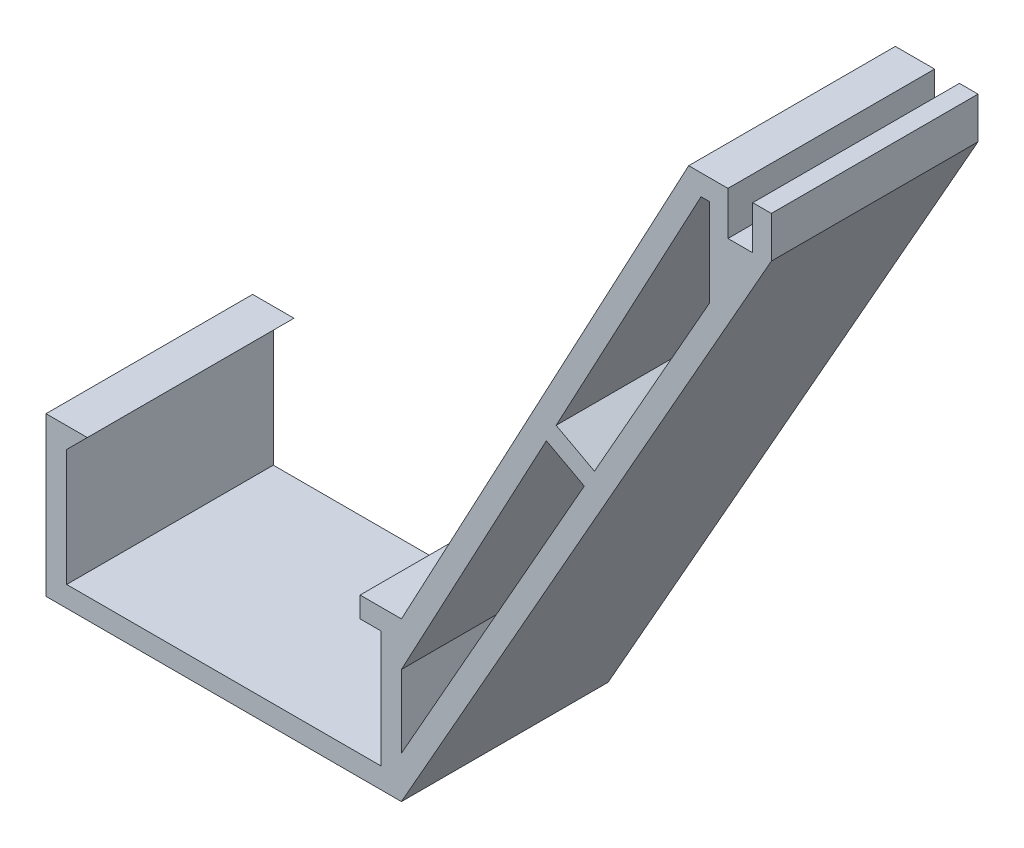
ISO-10303-21;
HEADER;
FILE_DESCRIPTION(('STEP AP214'),'2;1');
FILE_NAME('part.step','',(''),(''),'','','');
FILE_SCHEMA(('AUTOMOTIVE_DESIGN { 1 0 10303 214 1 1 1 1 }'));
ENDSEC;
DATA;
#1=APPLICATION_CONTEXT('core data for automotive mechanical design processes');
#2=APPLICATION_PROTOCOL_DEFINITION('international standard','automotive_design',2000,#1);
#3=PRODUCT_CONTEXT('',#1,'mechanical');
#4=PRODUCT('Part','Part','',(#3));
#5=PRODUCT_RELATED_PRODUCT_CATEGORY('part','',(#4));
#6=PRODUCT_DEFINITION_FORMATION('','',#4);
#7=PRODUCT_DEFINITION_CONTEXT('part definition',#1,'design');
#8=PRODUCT_DEFINITION('design','',#6,#7);
#9=PRODUCT_DEFINITION_SHAPE('','',#8);
#10=(LENGTH_UNIT() NAMED_UNIT(*) SI_UNIT(.MILLI.,.METRE.));
#11=(NAMED_UNIT(*) PLANE_ANGLE_UNIT() SI_UNIT($,.RADIAN.));
#12=(NAMED_UNIT(*) SI_UNIT($,.STERADIAN.) SOLID_ANGLE_UNIT());
#13=UNCERTAINTY_MEASURE_WITH_UNIT(LENGTH_MEASURE(1.E-05),#10,'distance_accuracy_value','');
#14=(GEOMETRIC_REPRESENTATION_CONTEXT(3) GLOBAL_UNCERTAINTY_ASSIGNED_CONTEXT((#13)) GLOBAL_UNIT_ASSIGNED_CONTEXT((#10,
#11,#12)) REPRESENTATION_CONTEXT('',''));
#15=CARTESIAN_POINT('',(0.,0.,0.));
#16=DIRECTION('',(0.,0.,1.));
#17=DIRECTION('',(1.,0.,0.));
#18=AXIS2_PLACEMENT_3D('',#15,#16,#17);
#19=CARTESIAN_POINT('',(15.2,-15.2,20.));
#20=DIRECTION('',(0.,-1.,0.));
#21=DIRECTION('',(0.,0.,-1.));
#22=AXIS2_PLACEMENT_3D('',#19,#20,#21);
#23=PLANE('',#22);
#24=DIRECTION('',(-1.,0.,0.));
#25=VECTOR('',#24,1.);
#26=CARTESIAN_POINT('',(15.2,-15.2,0.));
#27=LINE('',#26,#25);
#28=CARTESIAN_POINT('',(15.2,-15.2,0.));
#29=VERTEX_POINT('',#28);
#30=CARTESIAN_POINT('',(-15.2,-15.2,0.));
#31=VERTEX_POINT('',#30);
#32=EDGE_CURVE('E331',#29,#31,#27,.T.);
#33=ORIENTED_EDGE('',*,*,#32,.T.);
#34=DIRECTION('',(0.,0.,-1.));
#35=VECTOR('',#34,1.);
#36=CARTESIAN_POINT('',(-15.2,-15.2,20.));
#37=LINE('',#36,#35);
#38=CARTESIAN_POINT('',(-15.2,-15.2,20.));
#39=VERTEX_POINT('',#38);
#40=EDGE_CURVE('E11',#39,#31,#37,.T.);
#41=ORIENTED_EDGE('',*,*,#40,.F.);
#42=DIRECTION('',(-1.,0.,0.));
#43=VECTOR('',#42,1.);
#44=CARTESIAN_POINT('',(15.2,-15.2,20.));
#45=LINE('',#44,#43);
#46=CARTESIAN_POINT('',(15.2,-15.2,20.));
#47=VERTEX_POINT('',#46);
#48=EDGE_CURVE('E307',#47,#39,#45,.T.);
#49=ORIENTED_EDGE('',*,*,#48,.F.);
#50=DIRECTION('',(0.,0.,-1.));
#51=VECTOR('',#50,1.);
#52=CARTESIAN_POINT('',(15.2,-15.2,20.));
#53=LINE('',#52,#51);
#54=EDGE_CURVE('E330',#47,#29,#53,.T.);
#55=ORIENTED_EDGE('',*,*,#54,.T.);
#56=EDGE_LOOP('',(#33,#41,#49,#55));
#57=FACE_BOUND('',#56,.T.);
#58=ADVANCED_FACE('F33',(#57),#23,.F.);
#59=CARTESIAN_POINT('',(-15.2,-15.2,20.));
#60=DIRECTION('',(-1.,0.,0.));
#61=DIRECTION('',(0.,0.,1.));
#62=AXIS2_PLACEMENT_3D('',#59,#60,#61);
#63=PLANE('',#62);
#64=DIRECTION('',(0.,1.,0.));
#65=VECTOR('',#64,1.);
#66=CARTESIAN_POINT('',(-15.2,-15.2,0.));
#67=LINE('',#66,#65);
#68=CARTESIAN_POINT('',(-15.2,-3.885,0.));
#69=VERTEX_POINT('',#68);
#70=EDGE_CURVE('E334',#31,#69,#67,.T.);
#71=ORIENTED_EDGE('',*,*,#70,.T.);
#72=DIRECTION('',(0.,0.,-1.));
#73=VECTOR('',#72,1.);
#74=CARTESIAN_POINT('',(-15.2,-3.885,20.));
#75=LINE('',#74,#73);
#76=CARTESIAN_POINT('',(-15.2,-3.885,20.));
#77=VERTEX_POINT('',#76);
#78=EDGE_CURVE('E40',#77,#69,#75,.T.);
#79=ORIENTED_EDGE('',*,*,#78,.F.);
#80=DIRECTION('',(0.,1.,0.));
#81=VECTOR('',#80,1.);
#82=CARTESIAN_POINT('',(-15.2,-15.2,20.));
#83=LINE('',#82,#81);
#84=EDGE_CURVE('E310',#39,#77,#83,.T.);
#85=ORIENTED_EDGE('',*,*,#84,.F.);
#86=ORIENTED_EDGE('',*,*,#40,.T.);
#87=EDGE_LOOP('',(#71,#79,#85,#86));
#88=FACE_BOUND('',#87,.T.);
#89=ADVANCED_FACE('F407',(#88),#63,.F.);
#90=CARTESIAN_POINT('',(-15.2,-3.885,20.));
#91=DIRECTION('',(-0.707106781186547,0.707106781186548,0.));
#92=DIRECTION('',(-0.707106781186548,-0.707106781186547,0.));
#93=AXIS2_PLACEMENT_3D('',#90,#91,#92);
#94=PLANE('',#93);
#95=DIRECTION('',(0.707106781186548,0.707106781186547,0.));
#96=VECTOR('',#95,1.);
#97=CARTESIAN_POINT('',(-15.2,-3.885,0.));
#98=LINE('',#97,#96);
#99=CARTESIAN_POINT('',(-13.2,-1.885,0.));
#100=VERTEX_POINT('',#99);
#101=EDGE_CURVE('E337',#69,#100,#98,.T.);
#102=ORIENTED_EDGE('',*,*,#101,.T.);
#103=DIRECTION('',(0.,0.,-1.));
#104=VECTOR('',#103,1.);
#105=CARTESIAN_POINT('',(-13.2,-1.885,20.));
#106=LINE('',#105,#104);
#107=CARTESIAN_POINT('',(-13.2,-1.885,20.));
#108=VERTEX_POINT('',#107);
#109=EDGE_CURVE('E377',#108,#100,#106,.T.);
#110=ORIENTED_EDGE('',*,*,#109,.F.);
#111=DIRECTION('',(0.707106781186548,0.707106781186547,0.));
#112=VECTOR('',#111,1.);
#113=CARTESIAN_POINT('',(-15.2,-3.885,20.));
#114=LINE('',#113,#112);
#115=EDGE_CURVE('E313',#77,#108,#114,.T.);
#116=ORIENTED_EDGE('',*,*,#115,.F.);
#117=ORIENTED_EDGE('',*,*,#78,.T.);
#118=EDGE_LOOP('',(#102,#110,#116,#117));
#119=FACE_BOUND('',#118,.T.);
#120=ADVANCED_FACE('F384',(#119),#94,.F.);
#121=CARTESIAN_POINT('',(-17.2,-1.885,20.));
#122=DIRECTION('',(0.,-1.,0.));
#123=DIRECTION('',(1.,0.,0.));
#124=AXIS2_PLACEMENT_3D('',#121,#122,#123);
#125=PLANE('',#124);
#126=DIRECTION('',(-1.,0.,0.));
#127=VECTOR('',#126,1.);
#128=CARTESIAN_POINT('',(-17.2,-1.885,0.));
#129=LINE('',#128,#127);
#130=CARTESIAN_POINT('',(-17.2,-1.885,0.));
#131=VERTEX_POINT('',#130);
#132=EDGE_CURVE('E339',#100,#131,#129,.T.);
#133=ORIENTED_EDGE('',*,*,#132,.T.);
#134=DIRECTION('',(0.,0.,-1.));
#135=VECTOR('',#134,1.);
#136=CARTESIAN_POINT('',(-17.2,-1.885,20.));
#137=LINE('',#136,#135);
#138=CARTESIAN_POINT('',(-17.2,-1.885,20.));
#139=VERTEX_POINT('',#138);
#140=EDGE_CURVE('E374',#139,#131,#137,.T.);
#141=ORIENTED_EDGE('',*,*,#140,.F.);
#142=DIRECTION('',(-1.,0.,0.));
#143=VECTOR('',#142,1.);
#144=CARTESIAN_POINT('',(-17.2,-1.885,20.));
#145=LINE('',#144,#143);
#146=EDGE_CURVE('E315',#108,#139,#145,.T.);
#147=ORIENTED_EDGE('',*,*,#146,.F.);
#148=ORIENTED_EDGE('',*,*,#109,.T.);
#149=EDGE_LOOP('',(#133,#141,#147,#148));
#150=FACE_BOUND('',#149,.T.);
#151=ADVANCED_FACE('F394',(#150),#125,.F.);
#152=CARTESIAN_POINT('',(-17.2,-17.2,20.));
#153=DIRECTION('',(1.,0.,0.));
#154=DIRECTION('',(0.,0.,-1.));
#155=AXIS2_PLACEMENT_3D('',#152,#153,#154);
#156=PLANE('',#155);
#157=DIRECTION('',(0.,-1.,0.));
#158=VECTOR('',#157,1.);
#159=CARTESIAN_POINT('',(-17.2,-17.2,0.));
#160=LINE('',#159,#158);
#161=CARTESIAN_POINT('',(-17.2,-17.2,0.));
#162=VERTEX_POINT('',#161);
#163=EDGE_CURVE('E341',#131,#162,#160,.T.);
#164=ORIENTED_EDGE('',*,*,#163,.T.);
#165=DIRECTION('',(0.,0.,-1.));
#166=VECTOR('',#165,1.);
#167=CARTESIAN_POINT('',(-17.2,-17.2,20.));
#168=LINE('',#167,#166);
#169=CARTESIAN_POINT('',(-17.2,-17.2,20.));
#170=VERTEX_POINT('',#169);
#171=EDGE_CURVE('E371',#170,#162,#168,.T.);
#172=ORIENTED_EDGE('',*,*,#171,.F.);
#173=DIRECTION('',(0.,-1.,0.));
#174=VECTOR('',#173,1.);
#175=CARTESIAN_POINT('',(-17.2,-17.2,20.));
#176=LINE('',#175,#174);
#177=EDGE_CURVE('E317',#139,#170,#176,.T.);
#178=ORIENTED_EDGE('',*,*,#177,.F.);
#179=ORIENTED_EDGE('',*,*,#140,.T.);
#180=EDGE_LOOP('',(#164,#172,#178,#179));
#181=FACE_BOUND('',#180,.T.);
#182=ADVANCED_FACE('F398',(#181),#156,.F.);
#183=CARTESIAN_POINT('',(17.2,-17.2,20.));
#184=DIRECTION('',(0.,1.,0.));
#185=DIRECTION('',(0.,0.,1.));
#186=AXIS2_PLACEMENT_3D('',#183,#184,#185);
#187=PLANE('',#186);
#188=DIRECTION('',(1.,0.,0.));
#189=VECTOR('',#188,1.);
#190=CARTESIAN_POINT('',(17.2,-17.2,0.));
#191=LINE('',#190,#189);
#192=CARTESIAN_POINT('',(17.2,-17.2,0.));
#193=VERTEX_POINT('',#192);
#194=EDGE_CURVE('E343',#162,#193,#191,.T.);
#195=ORIENTED_EDGE('',*,*,#194,.T.);
#196=DIRECTION('',(0.,0.,-1.));
#197=VECTOR('',#196,1.);
#198=CARTESIAN_POINT('',(17.2,-17.2,20.));
#199=LINE('',#198,#197);
#200=CARTESIAN_POINT('',(17.2,-17.2,20.));
#201=VERTEX_POINT('',#200);
#202=EDGE_CURVE('E368',#201,#193,#199,.T.);
#203=ORIENTED_EDGE('',*,*,#202,.F.);
#204=DIRECTION('',(1.,0.,0.));
#205=VECTOR('',#204,1.);
#206=CARTESIAN_POINT('',(17.2,-17.2,20.));
#207=LINE('',#206,#205);
#208=EDGE_CURVE('E319',#170,#201,#207,.T.);
#209=ORIENTED_EDGE('',*,*,#208,.F.);
#210=ORIENTED_EDGE('',*,*,#171,.T.);
#211=EDGE_LOOP('',(#195,#203,#209,#210));
#212=FACE_BOUND('',#211,.T.);
#213=ADVANCED_FACE('F472',(#212),#187,.F.);
#214=CARTESIAN_POINT('',(17.2,-17.2,20.));
#215=DIRECTION('',(-1.,0.,0.));
#216=DIRECTION('',(0.,0.,1.));
#217=AXIS2_PLACEMENT_3D('',#214,#215,#216);
#218=PLANE('',#217);
#219=DIRECTION('',(0.,1.,0.));
#220=VECTOR('',#219,1.);
#221=CARTESIAN_POINT('',(17.2,-17.2,20.));
#222=LINE('',#221,#220);
#223=CARTESIAN_POINT('',(17.2,-13.1421646285549,20.));
#224=VERTEX_POINT('',#223);
#225=CARTESIAN_POINT('',(17.2,-6.11977292405833,20.));
#226=VERTEX_POINT('',#225);
#227=EDGE_CURVE('E51',#224,#226,#222,.T.);
#228=ORIENTED_EDGE('',*,*,#227,.F.);
#229=DIRECTION('',(0.,0.,-1.));
#230=VECTOR('',#229,1.);
#231=CARTESIAN_POINT('',(17.2,-13.1421646285549,96.1411846506213));
#232=LINE('',#231,#230);
#233=CARTESIAN_POINT('',(17.2,-13.1421646285549,0.));
#234=VERTEX_POINT('',#233);
#235=EDGE_CURVE('E292',#224,#234,#232,.T.);
#236=ORIENTED_EDGE('',*,*,#235,.T.);
#237=DIRECTION('',(0.,1.,0.));
#238=VECTOR('',#237,1.);
#239=CARTESIAN_POINT('',(17.2,-17.2,0.));
#240=LINE('',#239,#238);
#241=CARTESIAN_POINT('',(17.2,-6.11977292405833,0.));
#242=VERTEX_POINT('',#241);
#243=EDGE_CURVE('E345',#234,#242,#240,.T.);
#244=ORIENTED_EDGE('',*,*,#243,.T.);
#245=DIRECTION('',(0.,0.,-1.));
#246=VECTOR('',#245,1.);
#247=CARTESIAN_POINT('',(17.2,-6.11977292405833,96.1411846506213));
#248=LINE('',#247,#246);
#249=EDGE_CURVE('E47',#226,#242,#248,.T.);
#250=ORIENTED_EDGE('',*,*,#249,.F.);
#251=EDGE_LOOP('',(#228,#236,#244,#250));
#252=FACE_BOUND('',#251,.T.);
#253=ADVANCED_FACE('F534',(#252),#218,.F.);
#254=CARTESIAN_POINT('',(17.2,-1.885,20.));
#255=DIRECTION('',(0.,-1.,0.));
#256=DIRECTION('',(1.,0.,0.));
#257=AXIS2_PLACEMENT_3D('',#254,#255,#256);
#258=PLANE('',#257);
#259=DIRECTION('',(-1.,0.,0.));
#260=VECTOR('',#259,1.);
#261=CARTESIAN_POINT('',(17.2,-1.885,0.));
#262=LINE('',#261,#260);
#263=CARTESIAN_POINT('',(17.2,-1.885,0.));
#264=VERTEX_POINT('',#263);
#265=CARTESIAN_POINT('',(13.2,-1.885,0.));
#266=VERTEX_POINT('',#265);
#267=EDGE_CURVE('E347',#264,#266,#262,.T.);
#268=ORIENTED_EDGE('',*,*,#267,.T.);
#269=DIRECTION('',(0.,0.,-1.));
#270=VECTOR('',#269,1.);
#271=CARTESIAN_POINT('',(13.2,-1.885,20.));
#272=LINE('',#271,#270);
#273=CARTESIAN_POINT('',(13.2,-1.885,20.));
#274=VERTEX_POINT('',#273);
#275=EDGE_CURVE('E362',#274,#266,#272,.T.);
#276=ORIENTED_EDGE('',*,*,#275,.F.);
#277=DIRECTION('',(-1.,0.,0.));
#278=VECTOR('',#277,1.);
#279=CARTESIAN_POINT('',(17.2,-1.885,20.));
#280=LINE('',#279,#278);
#281=CARTESIAN_POINT('',(17.2,-1.885,20.));
#282=VERTEX_POINT('',#281);
#283=EDGE_CURVE('E322',#282,#274,#280,.T.);
#284=ORIENTED_EDGE('',*,*,#283,.F.);
#285=DIRECTION('',(0.,0.,-1.));
#286=VECTOR('',#285,1.);
#287=CARTESIAN_POINT('',(17.2,-1.885,20.));
#288=LINE('',#287,#286);
#289=EDGE_CURVE('E365',#282,#264,#288,.T.);
#290=ORIENTED_EDGE('',*,*,#289,.T.);
#291=EDGE_LOOP('',(#268,#276,#284,#290));
#292=FACE_BOUND('',#291,.T.);
#293=ADVANCED_FACE('F428',(#292),#258,.F.);
#294=CARTESIAN_POINT('',(13.2,-1.885,20.));
#295=DIRECTION('',(1.,0.,0.));
#296=DIRECTION('',(0.,0.,-1.));
#297=AXIS2_PLACEMENT_3D('',#294,#295,#296);
#298=PLANE('',#297);
#299=DIRECTION('',(0.,-1.,0.));
#300=VECTOR('',#299,1.);
#301=CARTESIAN_POINT('',(13.2,-1.885,0.));
#302=LINE('',#301,#300);
#303=CARTESIAN_POINT('',(13.2,-3.885,0.));
#304=VERTEX_POINT('',#303);
#305=EDGE_CURVE('E349',#266,#304,#302,.T.);
#306=ORIENTED_EDGE('',*,*,#305,.T.);
#307=DIRECTION('',(0.,0.,-1.));
#308=VECTOR('',#307,1.);
#309=CARTESIAN_POINT('',(13.2,-3.885,20.));
#310=LINE('',#309,#308);
#311=CARTESIAN_POINT('',(13.2,-3.885,20.));
#312=VERTEX_POINT('',#311);
#313=EDGE_CURVE('E359',#312,#304,#310,.T.);
#314=ORIENTED_EDGE('',*,*,#313,.F.);
#315=DIRECTION('',(0.,-1.,0.));
#316=VECTOR('',#315,1.);
#317=CARTESIAN_POINT('',(13.2,-1.885,20.));
#318=LINE('',#317,#316);
#319=EDGE_CURVE('E324',#274,#312,#318,.T.);
#320=ORIENTED_EDGE('',*,*,#319,.F.);
#321=ORIENTED_EDGE('',*,*,#275,.T.);
#322=EDGE_LOOP('',(#306,#314,#320,#321));
#323=FACE_BOUND('',#322,.T.);
#324=ADVANCED_FACE('F423',(#323),#298,.F.);
#325=CARTESIAN_POINT('',(15.2,-3.885,20.));
#326=DIRECTION('',(0.,1.,0.));
#327=DIRECTION('',(-1.,0.,0.));
#328=AXIS2_PLACEMENT_3D('',#325,#326,#327);
#329=PLANE('',#328);
#330=DIRECTION('',(1.,0.,0.));
#331=VECTOR('',#330,1.);
#332=CARTESIAN_POINT('',(15.2,-3.885,0.));
#333=LINE('',#332,#331);
#334=CARTESIAN_POINT('',(15.2,-3.885,0.));
#335=VERTEX_POINT('',#334);
#336=EDGE_CURVE('E351',#304,#335,#333,.T.);
#337=ORIENTED_EDGE('',*,*,#336,.T.);
#338=DIRECTION('',(0.,0.,-1.));
#339=VECTOR('',#338,1.);
#340=CARTESIAN_POINT('',(15.2,-3.885,20.));
#341=LINE('',#340,#339);
#342=CARTESIAN_POINT('',(15.2,-3.885,20.));
#343=VERTEX_POINT('',#342);
#344=EDGE_CURVE('E356',#343,#335,#341,.T.);
#345=ORIENTED_EDGE('',*,*,#344,.F.);
#346=DIRECTION('',(1.,0.,0.));
#347=VECTOR('',#346,1.);
#348=CARTESIAN_POINT('',(15.2,-3.885,20.));
#349=LINE('',#348,#347);
#350=EDGE_CURVE('E326',#312,#343,#349,.T.);
#351=ORIENTED_EDGE('',*,*,#350,.F.);
#352=ORIENTED_EDGE('',*,*,#313,.T.);
#353=EDGE_LOOP('',(#337,#345,#351,#352));
#354=FACE_BOUND('',#353,.T.);
#355=ADVANCED_FACE('F419',(#354),#329,.F.);
#356=CARTESIAN_POINT('',(15.2,-15.2,20.));
#357=DIRECTION('',(1.,0.,0.));
#358=DIRECTION('',(0.,0.,-1.));
#359=AXIS2_PLACEMENT_3D('',#356,#357,#358);
#360=PLANE('',#359);
#361=DIRECTION('',(0.,-1.,0.));
#362=VECTOR('',#361,1.);
#363=CARTESIAN_POINT('',(15.2,-15.2,0.));
#364=LINE('',#363,#362);
#365=EDGE_CURVE('E311',#335,#29,#364,.T.);
#366=ORIENTED_EDGE('',*,*,#365,.T.);
#367=ORIENTED_EDGE('',*,*,#54,.F.);
#368=DIRECTION('',(0.,-1.,0.));
#369=VECTOR('',#368,1.);
#370=CARTESIAN_POINT('',(15.2,-15.2,20.));
#371=LINE('',#370,#369);
#372=EDGE_CURVE('E328',#343,#47,#371,.T.);
#373=ORIENTED_EDGE('',*,*,#372,.F.);
#374=ORIENTED_EDGE('',*,*,#344,.T.);
#375=EDGE_LOOP('',(#366,#367,#373,#374));
#376=FACE_BOUND('',#375,.T.);
#377=ADVANCED_FACE('F414',(#376),#360,.F.);
#378=CARTESIAN_POINT('',(0.,0.,20.));
#379=DIRECTION('',(0.,0.,-1.));
#380=DIRECTION('',(-1.,0.,0.));
#381=AXIS2_PLACEMENT_3D('',#378,#379,#380);
#382=PLANE('',#381);
#383=DIRECTION('',(-0.492873617809624,-0.870100911887381,0.));
#384=VECTOR('',#383,1.);
#385=CARTESIAN_POINT('',(34.893740000279,18.093711573055,20.));
#386=LINE('',#385,#384);
#387=CARTESIAN_POINT('',(34.893740000279,18.093711573055,20.));
#388=VERTEX_POINT('',#387);
#389=EDGE_CURVE('E474',#388,#224,#386,.T.);
#390=ORIENTED_EDGE('',*,*,#389,.T.);
#391=ORIENTED_EDGE('',*,*,#227,.T.);
#392=DIRECTION('',(0.472280340850798,0.881448398742578,0.));
#393=VECTOR('',#392,1.);
#394=CARTESIAN_POINT('',(31.2264156916135,20.0586651392283,20.));
#395=LINE('',#394,#393);
#396=CARTESIAN_POINT('',(31.2264156916135,20.0586651392283,20.));
#397=VERTEX_POINT('',#396);
#398=EDGE_CURVE('E482',#226,#397,#395,.T.);
#399=ORIENTED_EDGE('',*,*,#398,.T.);
#400=DIRECTION('',(0.881448398742577,-0.4722803408508,0.));
#401=VECTOR('',#400,1.);
#402=CARTESIAN_POINT('',(31.2264156916135,20.0586651392283,20.));
#403=LINE('',#402,#401);
#404=EDGE_CURVE('E476',#397,#388,#403,.T.);
#405=ORIENTED_EDGE('',*,*,#404,.T.);
#406=EDGE_LOOP('',(#390,#391,#399,#405));
#407=FACE_BOUND('',#406,.T.);
#408=ORIENTED_EDGE('',*,*,#48,.T.);
#409=ORIENTED_EDGE('',*,*,#84,.T.);
#410=ORIENTED_EDGE('',*,*,#115,.T.);
#411=ORIENTED_EDGE('',*,*,#146,.T.);
#412=ORIENTED_EDGE('',*,*,#177,.T.);
#413=ORIENTED_EDGE('',*,*,#208,.T.);
#414=DIRECTION('',(0.492873617809624,0.870100911887381,0.));
#415=VECTOR('',#414,1.);
#416=CARTESIAN_POINT('',(53.,46.,20.));
#417=LINE('',#416,#415);
#418=CARTESIAN_POINT('',(53.,46.,20.));
#419=VERTEX_POINT('',#418);
#420=EDGE_CURVE('E473',#201,#419,#417,.T.);
#421=ORIENTED_EDGE('',*,*,#420,.T.);
#422=DIRECTION('',(0.,1.,0.));
#423=VECTOR('',#422,1.);
#424=CARTESIAN_POINT('',(53.,50.,20.));
#425=LINE('',#424,#423);
#426=CARTESIAN_POINT('',(53.,50.,20.));
#427=VERTEX_POINT('',#426);
#428=EDGE_CURVE('E467',#419,#427,#425,.T.);
#429=ORIENTED_EDGE('',*,*,#428,.T.);
#430=DIRECTION('',(-1.,0.,0.));
#431=VECTOR('',#430,1.);
#432=CARTESIAN_POINT('',(51.2,50.,20.));
#433=LINE('',#432,#431);
#434=CARTESIAN_POINT('',(51.2,50.,20.));
#435=VERTEX_POINT('',#434);
#436=EDGE_CURVE('E461',#427,#435,#433,.T.);
#437=ORIENTED_EDGE('',*,*,#436,.T.);
#438=DIRECTION('',(0.,-1.,0.));
#439=VECTOR('',#438,1.);
#440=CARTESIAN_POINT('',(51.2,50.,20.));
#441=LINE('',#440,#439);
#442=CARTESIAN_POINT('',(51.2,45.8,20.));
#443=VERTEX_POINT('',#442);
#444=EDGE_CURVE('E507',#435,#443,#441,.T.);
#445=ORIENTED_EDGE('',*,*,#444,.T.);
#446=DIRECTION('',(-1.,0.,0.));
#447=VECTOR('',#446,1.);
#448=CARTESIAN_POINT('',(51.2,45.8,20.));
#449=LINE('',#448,#447);
#450=CARTESIAN_POINT('',(48.8,45.8,20.));
#451=VERTEX_POINT('',#450);
#452=EDGE_CURVE('E306',#443,#451,#449,.T.);
#453=ORIENTED_EDGE('',*,*,#452,.T.);
#454=DIRECTION('',(0.,1.,0.));
#455=VECTOR('',#454,1.);
#456=CARTESIAN_POINT('',(48.8,45.8,20.));
#457=LINE('',#456,#455);
#458=CARTESIAN_POINT('',(48.8,50.,20.));
#459=VERTEX_POINT('',#458);
#460=EDGE_CURVE('E335',#451,#459,#457,.T.);
#461=ORIENTED_EDGE('',*,*,#460,.T.);
#462=DIRECTION('',(-1.,0.,0.));
#463=VECTOR('',#462,1.);
#464=CARTESIAN_POINT('',(45.,50.,20.));
#465=LINE('',#464,#463);
#466=CARTESIAN_POINT('',(45.,50.,20.));
#467=VERTEX_POINT('',#466);
#468=EDGE_CURVE('E485',#459,#467,#465,.T.);
#469=ORIENTED_EDGE('',*,*,#468,.T.);
#470=DIRECTION('',(-0.472280340850798,-0.881448398742578,0.));
#471=VECTOR('',#470,1.);
#472=CARTESIAN_POINT('',(45.,50.,20.));
#473=LINE('',#472,#471);
#474=EDGE_CURVE('E435',#467,#282,#473,.T.);
#475=ORIENTED_EDGE('',*,*,#474,.T.);
#476=ORIENTED_EDGE('',*,*,#283,.T.);
#477=ORIENTED_EDGE('',*,*,#319,.T.);
#478=ORIENTED_EDGE('',*,*,#350,.T.);
#479=ORIENTED_EDGE('',*,*,#372,.T.);
#480=EDGE_LOOP('',(#408,#409,#410,#411,#412,#413,#421,#429,#437,#445,#453,#461,#469,#475,#476,
#477,#478,#479));
#481=FACE_BOUND('',#480,.T.);
#482=DIRECTION('',(0.,1.,0.));
#483=VECTOR('',#482,1.);
#484=CARTESIAN_POINT('',(47.,48.,20.));
#485=LINE('',#484,#483);
#486=CARTESIAN_POINT('',(47.,39.4656566004953,20.));
#487=VERTEX_POINT('',#486);
#488=CARTESIAN_POINT('',(47.,48.,20.));
#489=VERTEX_POINT('',#488);
#490=EDGE_CURVE('E286',#487,#489,#485,.T.);
#491=ORIENTED_EDGE('',*,*,#490,.F.);
#492=DIRECTION('',(0.492873617809624,0.870100911887381,0.));
#493=VECTOR('',#492,1.);
#494=CARTESIAN_POINT('',(47.,39.4656566004953,20.));
#495=LINE('',#494,#493);
#496=CARTESIAN_POINT('',(35.8797597956875,19.834394563832,20.));
#497=VERTEX_POINT('',#496);
#498=EDGE_CURVE('E218',#497,#487,#495,.T.);
#499=ORIENTED_EDGE('',*,*,#498,.F.);
#500=DIRECTION('',(0.881448398742577,-0.472280340850799,0.));
#501=VECTOR('',#500,1.);
#502=CARTESIAN_POINT('',(32.1709763733151,21.8215619367134,20.));
#503=LINE('',#502,#501);
#504=CARTESIAN_POINT('',(32.1709763733151,21.8215619367134,20.));
#505=VERTEX_POINT('',#504);
#506=EDGE_CURVE('E499',#505,#497,#503,.T.);
#507=ORIENTED_EDGE('',*,*,#506,.F.);
#508=DIRECTION('',(-0.472280340850798,-0.881448398742578,0.));
#509=VECTOR('',#508,1.);
#510=CARTESIAN_POINT('',(46.1973920649286,48.,20.));
#511=LINE('',#510,#509);
#512=CARTESIAN_POINT('',(46.1973920649286,48.,20.));
#513=VERTEX_POINT('',#512);
#514=EDGE_CURVE('E495',#513,#505,#511,.T.);
#515=ORIENTED_EDGE('',*,*,#514,.F.);
#516=DIRECTION('',(-1.,0.,0.));
#517=VECTOR('',#516,1.);
#518=CARTESIAN_POINT('',(46.1973920649286,48.,20.));
#519=LINE('',#518,#517);
#520=EDGE_CURVE('E486',#489,#513,#519,.T.);
#521=ORIENTED_EDGE('',*,*,#520,.F.);
#522=EDGE_LOOP('',(#491,#499,#507,#515,#521));
#523=FACE_BOUND('',#522,.T.);
#524=ADVANCED_FACE('F402',(#407,#481,#523),#382,.F.);
#525=CARTESIAN_POINT('',(0.,0.,0.));
#526=DIRECTION('',(0.,0.,-1.));
#527=DIRECTION('',(-1.,0.,0.));
#528=AXIS2_PLACEMENT_3D('',#525,#526,#527);
#529=PLANE('',#528);
#530=ORIENTED_EDGE('',*,*,#243,.F.);
#531=DIRECTION('',(0.492873617809624,0.870100911887381,0.));
#532=VECTOR('',#531,1.);
#533=CARTESIAN_POINT('',(34.893740000279,18.093711573055,0.));
#534=LINE('',#533,#532);
#535=CARTESIAN_POINT('',(34.893740000279,18.093711573055,0.));
#536=VERTEX_POINT('',#535);
#537=EDGE_CURVE('E271',#234,#536,#534,.T.);
#538=ORIENTED_EDGE('',*,*,#537,.T.);
#539=DIRECTION('',(-0.881448398742577,0.4722803408508,0.));
#540=VECTOR('',#539,1.);
#541=CARTESIAN_POINT('',(31.2264156916135,20.0586651392283,0.));
#542=LINE('',#541,#540);
#543=CARTESIAN_POINT('',(31.2264156916135,20.0586651392283,0.));
#544=VERTEX_POINT('',#543);
#545=EDGE_CURVE('E274',#536,#544,#542,.T.);
#546=ORIENTED_EDGE('',*,*,#545,.T.);
#547=DIRECTION('',(-0.472280340850798,-0.881448398742578,0.));
#548=VECTOR('',#547,1.);
#549=CARTESIAN_POINT('',(31.2264156916135,20.0586651392283,0.));
#550=LINE('',#549,#548);
#551=EDGE_CURVE('E277',#544,#242,#550,.T.);
#552=ORIENTED_EDGE('',*,*,#551,.T.);
#553=EDGE_LOOP('',(#530,#538,#546,#552));
#554=FACE_BOUND('',#553,.T.);
#555=ORIENTED_EDGE('',*,*,#32,.F.);
#556=ORIENTED_EDGE('',*,*,#365,.F.);
#557=ORIENTED_EDGE('',*,*,#336,.F.);
#558=ORIENTED_EDGE('',*,*,#305,.F.);
#559=ORIENTED_EDGE('',*,*,#267,.F.);
#560=DIRECTION('',(0.472280340850798,0.881448398742578,0.));
#561=VECTOR('',#560,1.);
#562=CARTESIAN_POINT('',(45.,50.,0.));
#563=LINE('',#562,#561);
#564=CARTESIAN_POINT('',(45.,50.,0.));
#565=VERTEX_POINT('',#564);
#566=EDGE_CURVE('E280',#264,#565,#563,.T.);
#567=ORIENTED_EDGE('',*,*,#566,.T.);
#568=DIRECTION('',(1.,0.,0.));
#569=VECTOR('',#568,1.);
#570=CARTESIAN_POINT('',(45.,50.,0.));
#571=LINE('',#570,#569);
#572=CARTESIAN_POINT('',(48.8,50.,0.));
#573=VERTEX_POINT('',#572);
#574=EDGE_CURVE('E246',#565,#573,#571,.T.);
#575=ORIENTED_EDGE('',*,*,#574,.T.);
#576=DIRECTION('',(0.,-1.,0.));
#577=VECTOR('',#576,1.);
#578=CARTESIAN_POINT('',(48.8,45.8,0.));
#579=LINE('',#578,#577);
#580=CARTESIAN_POINT('',(48.8,45.8,0.));
#581=VERTEX_POINT('',#580);
#582=EDGE_CURVE('E253',#573,#581,#579,.T.);
#583=ORIENTED_EDGE('',*,*,#582,.T.);
#584=DIRECTION('',(1.,0.,0.));
#585=VECTOR('',#584,1.);
#586=CARTESIAN_POINT('',(51.2,45.8,0.));
#587=LINE('',#586,#585);
#588=CARTESIAN_POINT('',(51.2,45.8,0.));
#589=VERTEX_POINT('',#588);
#590=EDGE_CURVE('E256',#581,#589,#587,.T.);
#591=ORIENTED_EDGE('',*,*,#590,.T.);
#592=DIRECTION('',(0.,1.,0.));
#593=VECTOR('',#592,1.);
#594=CARTESIAN_POINT('',(51.2,50.,0.));
#595=LINE('',#594,#593);
#596=CARTESIAN_POINT('',(51.2,50.,0.));
#597=VERTEX_POINT('',#596);
#598=EDGE_CURVE('E259',#589,#597,#595,.T.);
#599=ORIENTED_EDGE('',*,*,#598,.T.);
#600=DIRECTION('',(1.,0.,0.));
#601=VECTOR('',#600,1.);
#602=CARTESIAN_POINT('',(51.2,50.,0.));
#603=LINE('',#602,#601);
#604=CARTESIAN_POINT('',(53.,50.,0.));
#605=VERTEX_POINT('',#604);
#606=EDGE_CURVE('E262',#597,#605,#603,.T.);
#607=ORIENTED_EDGE('',*,*,#606,.T.);
#608=DIRECTION('',(0.,-1.,0.));
#609=VECTOR('',#608,1.);
#610=CARTESIAN_POINT('',(53.,50.,0.));
#611=LINE('',#610,#609);
#612=CARTESIAN_POINT('',(53.,46.,0.));
#613=VERTEX_POINT('',#612);
#614=EDGE_CURVE('E265',#605,#613,#611,.T.);
#615=ORIENTED_EDGE('',*,*,#614,.T.);
#616=DIRECTION('',(-0.492873617809624,-0.870100911887381,0.));
#617=VECTOR('',#616,1.);
#618=CARTESIAN_POINT('',(53.,46.,0.));
#619=LINE('',#618,#617);
#620=EDGE_CURVE('E268',#613,#193,#619,.T.);
#621=ORIENTED_EDGE('',*,*,#620,.T.);
#622=ORIENTED_EDGE('',*,*,#194,.F.);
#623=ORIENTED_EDGE('',*,*,#163,.F.);
#624=ORIENTED_EDGE('',*,*,#132,.F.);
#625=ORIENTED_EDGE('',*,*,#101,.F.);
#626=ORIENTED_EDGE('',*,*,#70,.F.);
#627=EDGE_LOOP('',(#555,#556,#557,#558,#559,#567,#575,#583,#591,#599,#607,#615,#621,#622,#623,
#624,#625,#626));
#628=FACE_BOUND('',#627,.T.);
#629=DIRECTION('',(0.,-1.,0.));
#630=VECTOR('',#629,1.);
#631=CARTESIAN_POINT('',(47.,48.,0.));
#632=LINE('',#631,#630);
#633=CARTESIAN_POINT('',(47.,48.,0.));
#634=VERTEX_POINT('',#633);
#635=CARTESIAN_POINT('',(47.,39.4656566004953,0.));
#636=VERTEX_POINT('',#635);
#637=EDGE_CURVE('E225',#634,#636,#632,.T.);
#638=ORIENTED_EDGE('',*,*,#637,.F.);
#639=DIRECTION('',(1.,0.,0.));
#640=VECTOR('',#639,1.);
#641=CARTESIAN_POINT('',(46.1973920649286,48.,0.));
#642=LINE('',#641,#640);
#643=CARTESIAN_POINT('',(46.1973920649286,48.,0.));
#644=VERTEX_POINT('',#643);
#645=EDGE_CURVE('E231',#644,#634,#642,.T.);
#646=ORIENTED_EDGE('',*,*,#645,.F.);
#647=DIRECTION('',(0.472280340850798,0.881448398742578,0.));
#648=VECTOR('',#647,1.);
#649=CARTESIAN_POINT('',(46.1973920649286,48.,0.));
#650=LINE('',#649,#648);
#651=CARTESIAN_POINT('',(32.1709763733151,21.8215619367134,0.));
#652=VERTEX_POINT('',#651);
#653=EDGE_CURVE('E238',#652,#644,#650,.T.);
#654=ORIENTED_EDGE('',*,*,#653,.F.);
#655=DIRECTION('',(-0.881448398742577,0.472280340850799,0.));
#656=VECTOR('',#655,1.);
#657=CARTESIAN_POINT('',(32.1709763733151,21.8215619367134,0.));
#658=LINE('',#657,#656);
#659=CARTESIAN_POINT('',(35.8797597956875,19.834394563832,0.));
#660=VERTEX_POINT('',#659);
#661=EDGE_CURVE('E236',#660,#652,#658,.T.);
#662=ORIENTED_EDGE('',*,*,#661,.F.);
#663=DIRECTION('',(-0.492873617809624,-0.870100911887381,0.));
#664=VECTOR('',#663,1.);
#665=CARTESIAN_POINT('',(47.,39.4656566004953,0.));
#666=LINE('',#665,#664);
#667=EDGE_CURVE('E216',#636,#660,#666,.T.);
#668=ORIENTED_EDGE('',*,*,#667,.F.);
#669=EDGE_LOOP('',(#638,#646,#654,#662,#668));
#670=FACE_BOUND('',#669,.T.);
#671=ADVANCED_FACE('F233',(#554,#628,#670),#529,.T.);
#672=CARTESIAN_POINT('',(48.8,45.8,96.1411846506213));
#673=DIRECTION('',(1.,0.,0.));
#674=DIRECTION('',(0.,0.,-1.));
#675=AXIS2_PLACEMENT_3D('',#672,#673,#674);
#676=PLANE('',#675);
#677=ORIENTED_EDGE('',*,*,#460,.F.);
#678=DIRECTION('',(0.,0.,-1.));
#679=VECTOR('',#678,1.);
#680=CARTESIAN_POINT('',(48.8,45.8,96.1411846506213));
#681=LINE('',#680,#679);
#682=EDGE_CURVE('E302',#451,#581,#681,.T.);
#683=ORIENTED_EDGE('',*,*,#682,.T.);
#684=ORIENTED_EDGE('',*,*,#582,.F.);
#685=DIRECTION('',(0.,0.,-1.));
#686=VECTOR('',#685,1.);
#687=CARTESIAN_POINT('',(48.8,50.,96.1411846506213));
#688=LINE('',#687,#686);
#689=EDGE_CURVE('E283',#459,#573,#688,.T.);
#690=ORIENTED_EDGE('',*,*,#689,.F.);
#691=EDGE_LOOP('',(#677,#683,#684,#690));
#692=FACE_BOUND('',#691,.T.);
#693=ADVANCED_FACE('F444',(#692),#676,.T.);
#694=CARTESIAN_POINT('',(51.2,45.8,96.1411846506213));
#695=DIRECTION('',(0.,1.,0.));
#696=DIRECTION('',(0.,0.,1.));
#697=AXIS2_PLACEMENT_3D('',#694,#695,#696);
#698=PLANE('',#697);
#699=ORIENTED_EDGE('',*,*,#452,.F.);
#700=DIRECTION('',(0.,0.,-1.));
#701=VECTOR('',#700,1.);
#702=CARTESIAN_POINT('',(51.2,45.8,96.1411846506213));
#703=LINE('',#702,#701);
#704=EDGE_CURVE('E300',#443,#589,#703,.T.);
#705=ORIENTED_EDGE('',*,*,#704,.T.);
#706=ORIENTED_EDGE('',*,*,#590,.F.);
#707=ORIENTED_EDGE('',*,*,#682,.F.);
#708=EDGE_LOOP('',(#699,#705,#706,#707));
#709=FACE_BOUND('',#708,.T.);
#710=ADVANCED_FACE('F448',(#709),#698,.T.);
#711=CARTESIAN_POINT('',(51.2,50.,96.1411846506213));
#712=DIRECTION('',(-1.,0.,0.));
#713=DIRECTION('',(0.,0.,1.));
#714=AXIS2_PLACEMENT_3D('',#711,#712,#713);
#715=PLANE('',#714);
#716=ORIENTED_EDGE('',*,*,#444,.F.);
#717=DIRECTION('',(0.,0.,-1.));
#718=VECTOR('',#717,1.);
#719=CARTESIAN_POINT('',(51.2,50.,96.1411846506213));
#720=LINE('',#719,#718);
#721=EDGE_CURVE('E298',#435,#597,#720,.T.);
#722=ORIENTED_EDGE('',*,*,#721,.T.);
#723=ORIENTED_EDGE('',*,*,#598,.F.);
#724=ORIENTED_EDGE('',*,*,#704,.F.);
#725=EDGE_LOOP('',(#716,#722,#723,#724));
#726=FACE_BOUND('',#725,.T.);
#727=ADVANCED_FACE('F453',(#726),#715,.T.);
#728=CARTESIAN_POINT('',(51.2,50.,96.1411846506213));
#729=DIRECTION('',(0.,1.,0.));
#730=DIRECTION('',(0.,0.,1.));
#731=AXIS2_PLACEMENT_3D('',#728,#729,#730);
#732=PLANE('',#731);
#733=ORIENTED_EDGE('',*,*,#436,.F.);
#734=DIRECTION('',(0.,0.,-1.));
#735=VECTOR('',#734,1.);
#736=CARTESIAN_POINT('',(53.,50.,96.1411846506213));
#737=LINE('',#736,#735);
#738=EDGE_CURVE('E296',#427,#605,#737,.T.);
#739=ORIENTED_EDGE('',*,*,#738,.T.);
#740=ORIENTED_EDGE('',*,*,#606,.F.);
#741=ORIENTED_EDGE('',*,*,#721,.F.);
#742=EDGE_LOOP('',(#733,#739,#740,#741));
#743=FACE_BOUND('',#742,.T.);
#744=ADVANCED_FACE('F459',(#743),#732,.T.);
#745=CARTESIAN_POINT('',(53.,50.,96.1411846506213));
#746=DIRECTION('',(1.,0.,0.));
#747=DIRECTION('',(0.,0.,-1.));
#748=AXIS2_PLACEMENT_3D('',#745,#746,#747);
#749=PLANE('',#748);
#750=ORIENTED_EDGE('',*,*,#428,.F.);
#751=DIRECTION('',(0.,0.,-1.));
#752=VECTOR('',#751,1.);
#753=CARTESIAN_POINT('',(53.,46.,96.1411846506213));
#754=LINE('',#753,#752);
#755=EDGE_CURVE('E294',#419,#613,#754,.T.);
#756=ORIENTED_EDGE('',*,*,#755,.T.);
#757=ORIENTED_EDGE('',*,*,#614,.F.);
#758=ORIENTED_EDGE('',*,*,#738,.F.);
#759=EDGE_LOOP('',(#750,#756,#757,#758));
#760=FACE_BOUND('',#759,.T.);
#761=ADVANCED_FACE('F464',(#760),#749,.T.);
#762=CARTESIAN_POINT('',(53.,46.,96.1411846506213));
#763=DIRECTION('',(0.870100911887381,-0.492873617809624,0.));
#764=DIRECTION('',(0.492873617809624,0.870100911887381,0.));
#765=AXIS2_PLACEMENT_3D('',#762,#763,#764);
#766=PLANE('',#765);
#767=ORIENTED_EDGE('',*,*,#420,.F.);
#768=ORIENTED_EDGE('',*,*,#202,.T.);
#769=ORIENTED_EDGE('',*,*,#620,.F.);
#770=ORIENTED_EDGE('',*,*,#755,.F.);
#771=EDGE_LOOP('',(#767,#768,#769,#770));
#772=FACE_BOUND('',#771,.T.);
#773=ADVANCED_FACE('F470',(#772),#766,.T.);
#774=CARTESIAN_POINT('',(34.893740000279,18.093711573055,96.1411846506213));
#775=DIRECTION('',(-0.870100911887381,0.492873617809624,0.));
#776=DIRECTION('',(-0.492873617809624,-0.870100911887381,0.));
#777=AXIS2_PLACEMENT_3D('',#774,#775,#776);
#778=PLANE('',#777);
#779=ORIENTED_EDGE('',*,*,#389,.F.);
#780=DIRECTION('',(0.,0.,-1.));
#781=VECTOR('',#780,1.);
#782=CARTESIAN_POINT('',(34.893740000279,18.093711573055,96.1411846506213));
#783=LINE('',#782,#781);
#784=EDGE_CURVE('E290',#388,#536,#783,.T.);
#785=ORIENTED_EDGE('',*,*,#784,.T.);
#786=ORIENTED_EDGE('',*,*,#537,.F.);
#787=ORIENTED_EDGE('',*,*,#235,.F.);
#788=EDGE_LOOP('',(#779,#785,#786,#787));
#789=FACE_BOUND('',#788,.T.);
#790=ADVANCED_FACE('F631',(#789),#778,.T.);
#791=CARTESIAN_POINT('',(31.2264156916135,20.0586651392283,96.1411846506213));
#792=DIRECTION('',(-0.4722803408508,-0.881448398742576,0.));
#793=DIRECTION('',(0.881448398742577,-0.4722803408508,0.));
#794=AXIS2_PLACEMENT_3D('',#791,#792,#793);
#795=PLANE('',#794);
#796=ORIENTED_EDGE('',*,*,#404,.F.);
#797=DIRECTION('',(0.,0.,-1.));
#798=VECTOR('',#797,1.);
#799=CARTESIAN_POINT('',(31.2264156916135,20.0586651392283,96.1411846506213));
#800=LINE('',#799,#798);
#801=EDGE_CURVE('E288',#397,#544,#800,.T.);
#802=ORIENTED_EDGE('',*,*,#801,.T.);
#803=ORIENTED_EDGE('',*,*,#545,.F.);
#804=ORIENTED_EDGE('',*,*,#784,.F.);
#805=EDGE_LOOP('',(#796,#802,#803,#804));
#806=FACE_BOUND('',#805,.T.);
#807=ADVANCED_FACE('F640',(#806),#795,.T.);
#808=CARTESIAN_POINT('',(31.2264156916135,20.0586651392283,96.1411846506213));
#809=DIRECTION('',(0.881448398742578,-0.472280340850798,0.));
#810=DIRECTION('',(0.472280340850798,0.881448398742578,0.));
#811=AXIS2_PLACEMENT_3D('',#808,#809,#810);
#812=PLANE('',#811);
#813=ORIENTED_EDGE('',*,*,#398,.F.);
#814=ORIENTED_EDGE('',*,*,#249,.T.);
#815=ORIENTED_EDGE('',*,*,#551,.F.);
#816=ORIENTED_EDGE('',*,*,#801,.F.);
#817=EDGE_LOOP('',(#813,#814,#815,#816));
#818=FACE_BOUND('',#817,.T.);
#819=ADVANCED_FACE('F650',(#818),#812,.T.);
#820=CARTESIAN_POINT('',(45.,50.,96.1411846506213));
#821=DIRECTION('',(-0.881448398742578,0.472280340850798,0.));
#822=DIRECTION('',(-0.472280340850798,-0.881448398742578,0.));
#823=AXIS2_PLACEMENT_3D('',#820,#821,#822);
#824=PLANE('',#823);
#825=ORIENTED_EDGE('',*,*,#474,.F.);
#826=DIRECTION('',(0.,0.,-1.));
#827=VECTOR('',#826,1.);
#828=CARTESIAN_POINT('',(45.,50.,96.1411846506213));
#829=LINE('',#828,#827);
#830=EDGE_CURVE('E284',#467,#565,#829,.T.);
#831=ORIENTED_EDGE('',*,*,#830,.T.);
#832=ORIENTED_EDGE('',*,*,#566,.F.);
#833=ORIENTED_EDGE('',*,*,#289,.F.);
#834=EDGE_LOOP('',(#825,#831,#832,#833));
#835=FACE_BOUND('',#834,.T.);
#836=ADVANCED_FACE('F432',(#835),#824,.T.);
#837=CARTESIAN_POINT('',(45.,50.,96.1411846506213));
#838=DIRECTION('',(0.,1.,0.));
#839=DIRECTION('',(0.,0.,1.));
#840=AXIS2_PLACEMENT_3D('',#837,#838,#839);
#841=PLANE('',#840);
#842=ORIENTED_EDGE('',*,*,#468,.F.);
#843=ORIENTED_EDGE('',*,*,#689,.T.);
#844=ORIENTED_EDGE('',*,*,#574,.F.);
#845=ORIENTED_EDGE('',*,*,#830,.F.);
#846=EDGE_LOOP('',(#842,#843,#844,#845));
#847=FACE_BOUND('',#846,.T.);
#848=ADVANCED_FACE('F438',(#847),#841,.T.);
#849=CARTESIAN_POINT('',(47.,48.,96.1411846506213));
#850=DIRECTION('',(1.,0.,0.));
#851=DIRECTION('',(0.,0.,-1.));
#852=AXIS2_PLACEMENT_3D('',#849,#850,#851);
#853=PLANE('',#852);
#854=DIRECTION('',(0.,0.,-1.));
#855=VECTOR('',#854,1.);
#856=CARTESIAN_POINT('',(47.,39.4656566004953,96.1411846506213));
#857=LINE('',#856,#855);
#858=EDGE_CURVE('E211',#487,#636,#857,.T.);
#859=ORIENTED_EDGE('',*,*,#858,.F.);
#860=ORIENTED_EDGE('',*,*,#490,.T.);
#861=DIRECTION('',(0.,0.,-1.));
#862=VECTOR('',#861,1.);
#863=CARTESIAN_POINT('',(47.,48.,96.1411846506213));
#864=LINE('',#863,#862);
#865=EDGE_CURVE('E222',#489,#634,#864,.T.);
#866=ORIENTED_EDGE('',*,*,#865,.T.);
#867=ORIENTED_EDGE('',*,*,#637,.T.);
#868=EDGE_LOOP('',(#859,#860,#866,#867));
#869=FACE_BOUND('',#868,.T.);
#870=ADVANCED_FACE('F226',(#869),#853,.F.);
#871=CARTESIAN_POINT('',(47.,39.4656566004953,96.1411846506213));
#872=DIRECTION('',(0.870100911887381,-0.492873617809624,0.));
#873=DIRECTION('',(0.492873617809624,0.870100911887381,0.));
#874=AXIS2_PLACEMENT_3D('',#871,#872,#873);
#875=PLANE('',#874);
#876=DIRECTION('',(0.,0.,-1.));
#877=VECTOR('',#876,1.);
#878=CARTESIAN_POINT('',(35.8797597956875,19.834394563832,96.1411846506213));
#879=LINE('',#878,#877);
#880=EDGE_CURVE('E221',#497,#660,#879,.T.);
#881=ORIENTED_EDGE('',*,*,#880,.F.);
#882=ORIENTED_EDGE('',*,*,#498,.T.);
#883=ORIENTED_EDGE('',*,*,#858,.T.);
#884=ORIENTED_EDGE('',*,*,#667,.T.);
#885=EDGE_LOOP('',(#881,#882,#883,#884));
#886=FACE_BOUND('',#885,.T.);
#887=ADVANCED_FACE('F214',(#886),#875,.F.);
#888=CARTESIAN_POINT('',(32.1709763733151,21.8215619367134,96.1411846506213));
#889=DIRECTION('',(-0.472280340850799,-0.881448398742577,0.));
#890=DIRECTION('',(0.881448398742577,-0.472280340850799,0.));
#891=AXIS2_PLACEMENT_3D('',#888,#889,#890);
#892=PLANE('',#891);
#893=DIRECTION('',(0.,0.,-1.));
#894=VECTOR('',#893,1.);
#895=CARTESIAN_POINT('',(32.1709763733151,21.8215619367134,96.1411846506213));
#896=LINE('',#895,#894);
#897=EDGE_CURVE('E247',#505,#652,#896,.T.);
#898=ORIENTED_EDGE('',*,*,#897,.F.);
#899=ORIENTED_EDGE('',*,*,#506,.T.);
#900=ORIENTED_EDGE('',*,*,#880,.T.);
#901=ORIENTED_EDGE('',*,*,#661,.T.);
#902=EDGE_LOOP('',(#898,#899,#900,#901));
#903=FACE_BOUND('',#902,.T.);
#904=ADVANCED_FACE('F498',(#903),#892,.F.);
#905=CARTESIAN_POINT('',(46.1973920649286,48.,96.1411846506213));
#906=DIRECTION('',(-0.881448398742578,0.472280340850798,0.));
#907=DIRECTION('',(-0.472280340850798,-0.881448398742578,0.));
#908=AXIS2_PLACEMENT_3D('',#905,#906,#907);
#909=PLANE('',#908);
#910=DIRECTION('',(0.,0.,-1.));
#911=VECTOR('',#910,1.);
#912=CARTESIAN_POINT('',(46.1973920649286,48.,96.1411846506213));
#913=LINE('',#912,#911);
#914=EDGE_CURVE('E244',#513,#644,#913,.T.);
#915=ORIENTED_EDGE('',*,*,#914,.F.);
#916=ORIENTED_EDGE('',*,*,#514,.T.);
#917=ORIENTED_EDGE('',*,*,#897,.T.);
#918=ORIENTED_EDGE('',*,*,#653,.T.);
#919=EDGE_LOOP('',(#915,#916,#917,#918));
#920=FACE_BOUND('',#919,.T.);
#921=ADVANCED_FACE('F492',(#920),#909,.F.);
#922=CARTESIAN_POINT('',(46.1973920649286,48.,96.1411846506213));
#923=DIRECTION('',(0.,1.,0.));
#924=DIRECTION('',(0.,0.,1.));
#925=AXIS2_PLACEMENT_3D('',#922,#923,#924);
#926=PLANE('',#925);
#927=ORIENTED_EDGE('',*,*,#865,.F.);
#928=ORIENTED_EDGE('',*,*,#520,.T.);
#929=ORIENTED_EDGE('',*,*,#914,.T.);
#930=ORIENTED_EDGE('',*,*,#645,.T.);
#931=EDGE_LOOP('',(#927,#928,#929,#930));
#932=FACE_BOUND('',#931,.T.);
#933=ADVANCED_FACE('F488',(#932),#926,.F.);
#934=CLOSED_SHELL('',(#58,#89,#120,#151,#182,#213,#253,#293,#324,#355,#377,#524,#671,#693,#710,
#727,#744,#761,#773,#790,#807,#819,#836,#848,#870,#887,#904,#921,#933));
#935=MANIFOLD_SOLID_BREP('B2',#934);
#936=ADVANCED_BREP_SHAPE_REPRESENTATION('',(#18,#935),#14);
#937=SHAPE_DEFINITION_REPRESENTATION(#9,#936);
ENDSEC;
END-ISO-10303-21;
